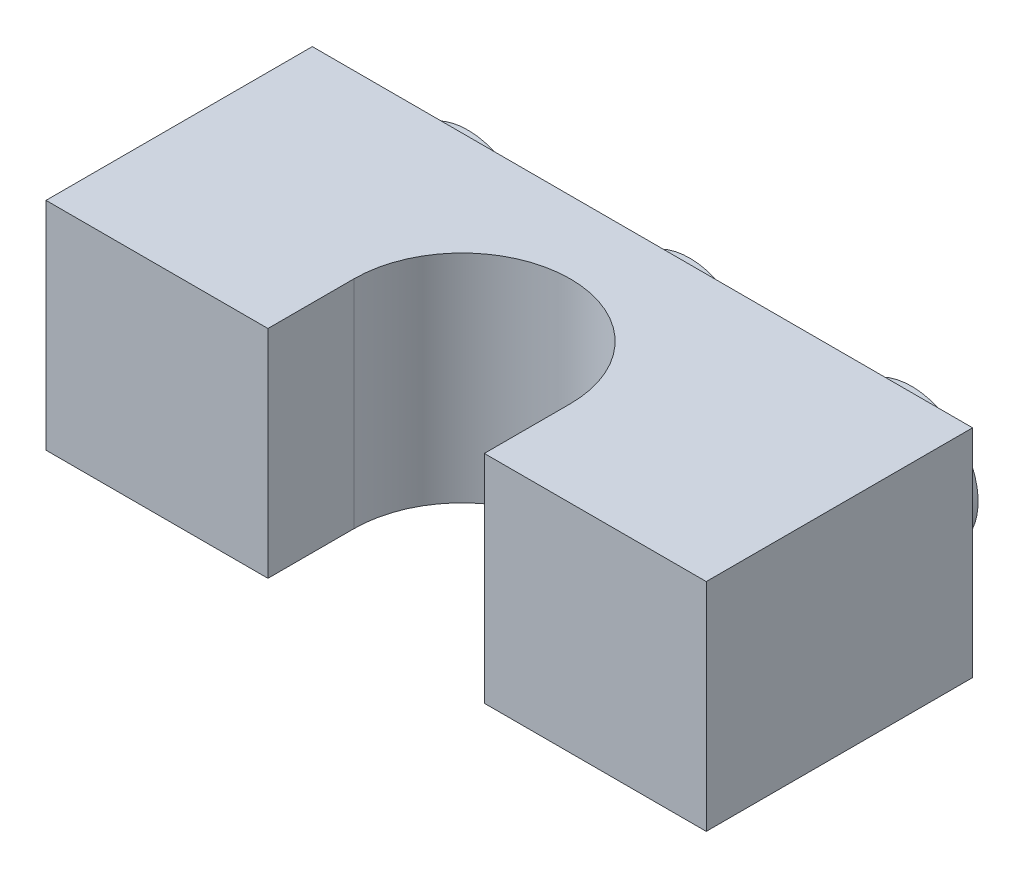
ISO-10303-21;
HEADER;
FILE_DESCRIPTION(('STEP AP214'),'2;1');
FILE_NAME('part.step','',(''),(''),'','','');
FILE_SCHEMA(('AUTOMOTIVE_DESIGN { 1 0 10303 214 1 1 1 1 }'));
ENDSEC;
DATA;
#1=APPLICATION_CONTEXT('core data for automotive mechanical design processes');
#2=APPLICATION_PROTOCOL_DEFINITION('international standard','automotive_design',2000,#1);
#3=PRODUCT_CONTEXT('',#1,'mechanical');
#4=PRODUCT('Part','Part','',(#3));
#5=PRODUCT_RELATED_PRODUCT_CATEGORY('part','',(#4));
#6=PRODUCT_DEFINITION_FORMATION('','',#4);
#7=PRODUCT_DEFINITION_CONTEXT('part definition',#1,'design');
#8=PRODUCT_DEFINITION('design','',#6,#7);
#9=PRODUCT_DEFINITION_SHAPE('','',#8);
#10=(LENGTH_UNIT() NAMED_UNIT(*) SI_UNIT(.MILLI.,.METRE.));
#11=(NAMED_UNIT(*) PLANE_ANGLE_UNIT() SI_UNIT($,.RADIAN.));
#12=(NAMED_UNIT(*) SI_UNIT($,.STERADIAN.) SOLID_ANGLE_UNIT());
#13=UNCERTAINTY_MEASURE_WITH_UNIT(LENGTH_MEASURE(1.E-05),#10,'distance_accuracy_value','');
#14=(GEOMETRIC_REPRESENTATION_CONTEXT(3) GLOBAL_UNCERTAINTY_ASSIGNED_CONTEXT((#13)) GLOBAL_UNIT_ASSIGNED_CONTEXT((#10,
#11,#12)) REPRESENTATION_CONTEXT('',''));
#15=CARTESIAN_POINT('',(0.,0.,0.));
#16=DIRECTION('',(0.,0.,1.));
#17=DIRECTION('',(1.,0.,0.));
#18=AXIS2_PLACEMENT_3D('',#15,#16,#17);
#19=CARTESIAN_POINT('',(0.,0.,9.6));
#20=DIRECTION('',(0.,0.,-1.));
#21=DIRECTION('',(-1.,0.,0.));
#22=AXIS2_PLACEMENT_3D('',#19,#20,#21);
#23=PLANE('',#22);
#24=DIRECTION('',(1.,0.,0.));
#25=VECTOR('',#24,1.);
#26=CARTESIAN_POINT('',(-11.9,-3.9,9.6));
#27=LINE('',#26,#25);
#28=CARTESIAN_POINT('',(-11.9,-3.9,9.6));
#29=VERTEX_POINT('',#28);
#30=CARTESIAN_POINT('',(-3.9,-3.9,9.6));
#31=VERTEX_POINT('',#30);
#32=EDGE_CURVE('E160',#29,#31,#27,.T.);
#33=ORIENTED_EDGE('',*,*,#32,.T.);
#34=DIRECTION('',(0.,1.,0.));
#35=VECTOR('',#34,1.);
#36=CARTESIAN_POINT('',(-3.9,0.,9.6));
#37=LINE('',#36,#35);
#38=CARTESIAN_POINT('',(-3.9,3.9,9.6));
#39=VERTEX_POINT('',#38);
#40=EDGE_CURVE('E11',#31,#39,#37,.T.);
#41=ORIENTED_EDGE('',*,*,#40,.T.);
#42=DIRECTION('',(-1.,0.,0.));
#43=VECTOR('',#42,1.);
#44=CARTESIAN_POINT('',(-11.9,3.9,9.6));
#45=LINE('',#44,#43);
#46=CARTESIAN_POINT('',(-11.9,3.9,9.6));
#47=VERTEX_POINT('',#46);
#48=EDGE_CURVE('E156',#39,#47,#45,.T.);
#49=ORIENTED_EDGE('',*,*,#48,.T.);
#50=DIRECTION('',(0.,-1.,0.));
#51=VECTOR('',#50,1.);
#52=CARTESIAN_POINT('',(-11.9,-3.9,9.6));
#53=LINE('',#52,#51);
#54=EDGE_CURVE('E158',#47,#29,#53,.T.);
#55=ORIENTED_EDGE('',*,*,#54,.T.);
#56=EDGE_LOOP('',(#33,#41,#49,#55));
#57=FACE_BOUND('',#56,.T.);
#58=ADVANCED_FACE('F35',(#57),#23,.F.);
#59=CARTESIAN_POINT('',(0.,0.,0.));
#60=DIRECTION('',(0.,0.,-1.));
#61=DIRECTION('',(-1.,0.,0.));
#62=AXIS2_PLACEMENT_3D('',#59,#60,#61);
#63=PLANE('',#62);
#64=CARTESIAN_POINT('',(-8.,0.,0.));
#65=DIRECTION('',(0.,0.,-1.));
#66=DIRECTION('',(-1.,0.,0.));
#67=AXIS2_PLACEMENT_3D('',#64,#65,#66);
#68=CIRCLE('',#67,2.4);
#69=CARTESIAN_POINT('',(-10.4,0.,0.));
#70=VERTEX_POINT('',#69);
#71=EDGE_CURVE('E139',#70,#70,#68,.T.);
#72=ORIENTED_EDGE('',*,*,#71,.F.);
#73=EDGE_LOOP('',(#72));
#74=FACE_BOUND('',#73,.T.);
#75=DIRECTION('',(0.,1.,0.));
#76=VECTOR('',#75,1.);
#77=CARTESIAN_POINT('',(11.9,-3.9,0.));
#78=LINE('',#77,#76);
#79=CARTESIAN_POINT('',(11.9,-3.9,0.));
#80=VERTEX_POINT('',#79);
#81=CARTESIAN_POINT('',(11.9,3.9,0.));
#82=VERTEX_POINT('',#81);
#83=EDGE_CURVE('E151',#80,#82,#78,.T.);
#84=ORIENTED_EDGE('',*,*,#83,.F.);
#85=DIRECTION('',(1.,0.,0.));
#86=VECTOR('',#85,1.);
#87=CARTESIAN_POINT('',(-11.9,-3.9,0.));
#88=LINE('',#87,#86);
#89=CARTESIAN_POINT('',(-11.9,-3.9,0.));
#90=VERTEX_POINT('',#89);
#91=EDGE_CURVE('E80',#90,#80,#88,.T.);
#92=ORIENTED_EDGE('',*,*,#91,.F.);
#93=DIRECTION('',(0.,-1.,0.));
#94=VECTOR('',#93,1.);
#95=CARTESIAN_POINT('',(-11.9,-3.9,0.));
#96=LINE('',#95,#94);
#97=CARTESIAN_POINT('',(-11.9,3.9,0.));
#98=VERTEX_POINT('',#97);
#99=EDGE_CURVE('E168',#98,#90,#96,.T.);
#100=ORIENTED_EDGE('',*,*,#99,.F.);
#101=DIRECTION('',(-1.,0.,0.));
#102=VECTOR('',#101,1.);
#103=CARTESIAN_POINT('',(-11.9,3.9,0.));
#104=LINE('',#103,#102);
#105=EDGE_CURVE('E166',#82,#98,#104,.T.);
#106=ORIENTED_EDGE('',*,*,#105,.F.);
#107=EDGE_LOOP('',(#84,#92,#100,#106));
#108=FACE_BOUND('',#107,.T.);
#109=CARTESIAN_POINT('',(0.,0.,0.));
#110=DIRECTION('',(0.,0.,-1.));
#111=DIRECTION('',(-1.,0.,0.));
#112=AXIS2_PLACEMENT_3D('',#109,#110,#111);
#113=CIRCLE('',#112,2.4);
#114=CARTESIAN_POINT('',(-2.4,0.,0.));
#115=VERTEX_POINT('',#114);
#116=EDGE_CURVE('E145',#115,#115,#113,.T.);
#117=ORIENTED_EDGE('',*,*,#116,.F.);
#118=EDGE_LOOP('',(#117));
#119=FACE_BOUND('',#118,.T.);
#120=CARTESIAN_POINT('',(8.,0.,0.));
#121=DIRECTION('',(0.,0.,-1.));
#122=DIRECTION('',(-1.,0.,0.));
#123=AXIS2_PLACEMENT_3D('',#120,#121,#122);
#124=CIRCLE('',#123,2.4);
#125=CARTESIAN_POINT('',(5.6,0.,0.));
#126=VERTEX_POINT('',#125);
#127=EDGE_CURVE('E134',#126,#126,#124,.T.);
#128=ORIENTED_EDGE('',*,*,#127,.F.);
#129=EDGE_LOOP('',(#128));
#130=FACE_BOUND('',#129,.T.);
#131=ADVANCED_FACE('F193',(#74,#108,#119,#130),#63,.T.);
#132=CARTESIAN_POINT('',(11.9,-3.9,9.6));
#133=DIRECTION('',(-1.,0.,0.));
#134=DIRECTION('',(0.,0.,1.));
#135=AXIS2_PLACEMENT_3D('',#132,#133,#134);
#136=PLANE('',#135);
#137=ORIENTED_EDGE('',*,*,#83,.T.);
#138=DIRECTION('',(0.,0.,-1.));
#139=VECTOR('',#138,1.);
#140=CARTESIAN_POINT('',(11.9,3.9,9.6));
#141=LINE('',#140,#139);
#142=CARTESIAN_POINT('',(11.9,3.9,9.6));
#143=VERTEX_POINT('',#142);
#144=EDGE_CURVE('E177',#143,#82,#141,.T.);
#145=ORIENTED_EDGE('',*,*,#144,.F.);
#146=DIRECTION('',(0.,1.,0.));
#147=VECTOR('',#146,1.);
#148=CARTESIAN_POINT('',(11.9,-3.9,9.6));
#149=LINE('',#148,#147);
#150=CARTESIAN_POINT('',(11.9,-3.9,9.6));
#151=VERTEX_POINT('',#150);
#152=EDGE_CURVE('E154',#151,#143,#149,.T.);
#153=ORIENTED_EDGE('',*,*,#152,.F.);
#154=DIRECTION('',(0.,0.,-1.));
#155=VECTOR('',#154,1.);
#156=CARTESIAN_POINT('',(11.9,-3.9,9.6));
#157=LINE('',#156,#155);
#158=EDGE_CURVE('E163',#151,#80,#157,.T.);
#159=ORIENTED_EDGE('',*,*,#158,.T.);
#160=EDGE_LOOP('',(#137,#145,#153,#159));
#161=FACE_BOUND('',#160,.T.);
#162=ADVANCED_FACE('F37',(#161),#136,.F.);
#163=CARTESIAN_POINT('',(-11.9,3.9,9.6));
#164=DIRECTION('',(0.,-1.,0.));
#165=DIRECTION('',(0.,0.,-1.));
#166=AXIS2_PLACEMENT_3D('',#163,#164,#165);
#167=PLANE('',#166);
#168=ORIENTED_EDGE('',*,*,#48,.F.);
#169=DIRECTION('',(0.,0.,1.));
#170=VECTOR('',#169,1.);
#171=CARTESIAN_POINT('',(-3.9,3.9,16.6));
#172=LINE('',#171,#170);
#173=CARTESIAN_POINT('',(-3.9,3.9,6.5));
#174=VERTEX_POINT('',#173);
#175=EDGE_CURVE('E130',#174,#39,#172,.T.);
#176=ORIENTED_EDGE('',*,*,#175,.F.);
#177=CARTESIAN_POINT('',(0.,3.9,6.5));
#178=DIRECTION('',(0.,1.,0.));
#179=DIRECTION('',(0.,0.,1.));
#180=AXIS2_PLACEMENT_3D('',#177,#178,#179);
#181=CIRCLE('',#180,3.9);
#182=CARTESIAN_POINT('',(3.9,3.9,6.5));
#183=VERTEX_POINT('',#182);
#184=EDGE_CURVE('E127',#183,#174,#181,.T.);
#185=ORIENTED_EDGE('',*,*,#184,.F.);
#186=DIRECTION('',(0.,0.,-1.));
#187=VECTOR('',#186,1.);
#188=CARTESIAN_POINT('',(3.9,3.9,16.6));
#189=LINE('',#188,#187);
#190=CARTESIAN_POINT('',(3.9,3.9,9.6));
#191=VERTEX_POINT('',#190);
#192=EDGE_CURVE('E112',#191,#183,#189,.T.);
#193=ORIENTED_EDGE('',*,*,#192,.F.);
#194=EDGE_CURVE('E88',#143,#191,#45,.T.);
#195=ORIENTED_EDGE('',*,*,#194,.F.);
#196=ORIENTED_EDGE('',*,*,#144,.T.);
#197=ORIENTED_EDGE('',*,*,#105,.T.);
#198=DIRECTION('',(0.,0.,-1.));
#199=VECTOR('',#198,1.);
#200=CARTESIAN_POINT('',(-11.9,3.9,9.6));
#201=LINE('',#200,#199);
#202=EDGE_CURVE('E174',#47,#98,#201,.T.);
#203=ORIENTED_EDGE('',*,*,#202,.F.);
#204=EDGE_LOOP('',(#168,#176,#185,#193,#195,#196,#197,#203));
#205=FACE_BOUND('',#204,.T.);
#206=ADVANCED_FACE('F180',(#205),#167,.F.);
#207=CARTESIAN_POINT('',(-11.9,-3.9,9.6));
#208=DIRECTION('',(1.,0.,0.));
#209=DIRECTION('',(0.,0.,-1.));
#210=AXIS2_PLACEMENT_3D('',#207,#208,#209);
#211=PLANE('',#210);
#212=ORIENTED_EDGE('',*,*,#99,.T.);
#213=DIRECTION('',(0.,0.,-1.));
#214=VECTOR('',#213,1.);
#215=CARTESIAN_POINT('',(-11.9,-3.9,9.6));
#216=LINE('',#215,#214);
#217=EDGE_CURVE('E172',#29,#90,#216,.T.);
#218=ORIENTED_EDGE('',*,*,#217,.F.);
#219=ORIENTED_EDGE('',*,*,#54,.F.);
#220=ORIENTED_EDGE('',*,*,#202,.T.);
#221=EDGE_LOOP('',(#212,#218,#219,#220));
#222=FACE_BOUND('',#221,.T.);
#223=ADVANCED_FACE('F198',(#222),#211,.F.);
#224=CARTESIAN_POINT('',(-11.9,-3.9,9.6));
#225=DIRECTION('',(0.,1.,0.));
#226=DIRECTION('',(0.,0.,1.));
#227=AXIS2_PLACEMENT_3D('',#224,#225,#226);
#228=PLANE('',#227);
#229=CARTESIAN_POINT('',(0.,-3.9,6.5));
#230=DIRECTION('',(0.,1.,0.));
#231=DIRECTION('',(0.,0.,1.));
#232=AXIS2_PLACEMENT_3D('',#229,#230,#231);
#233=CIRCLE('',#232,3.9);
#234=CARTESIAN_POINT('',(3.9,-3.9,6.5));
#235=VERTEX_POINT('',#234);
#236=CARTESIAN_POINT('',(-3.9,-3.9,6.5));
#237=VERTEX_POINT('',#236);
#238=EDGE_CURVE('E117',#235,#237,#233,.T.);
#239=ORIENTED_EDGE('',*,*,#238,.T.);
#240=DIRECTION('',(0.,0.,1.));
#241=VECTOR('',#240,1.);
#242=CARTESIAN_POINT('',(-3.9,-3.9,16.6));
#243=LINE('',#242,#241);
#244=EDGE_CURVE('E125',#237,#31,#243,.T.);
#245=ORIENTED_EDGE('',*,*,#244,.T.);
#246=ORIENTED_EDGE('',*,*,#32,.F.);
#247=ORIENTED_EDGE('',*,*,#217,.T.);
#248=ORIENTED_EDGE('',*,*,#91,.T.);
#249=ORIENTED_EDGE('',*,*,#158,.F.);
#250=CARTESIAN_POINT('',(3.9,-3.9,9.6));
#251=VERTEX_POINT('',#250);
#252=EDGE_CURVE('E58',#251,#151,#27,.T.);
#253=ORIENTED_EDGE('',*,*,#252,.F.);
#254=DIRECTION('',(0.,0.,-1.));
#255=VECTOR('',#254,1.);
#256=CARTESIAN_POINT('',(3.9,-3.9,16.6));
#257=LINE('',#256,#255);
#258=EDGE_CURVE('E50',#251,#235,#257,.T.);
#259=ORIENTED_EDGE('',*,*,#258,.T.);
#260=EDGE_LOOP('',(#239,#245,#246,#247,#248,#249,#253,#259));
#261=FACE_BOUND('',#260,.T.);
#262=ADVANCED_FACE('F124',(#261),#228,.F.);
#263=ORIENTED_EDGE('',*,*,#194,.T.);
#264=DIRECTION('',(0.,-1.,0.));
#265=VECTOR('',#264,1.);
#266=CARTESIAN_POINT('',(3.9,0.,9.6));
#267=LINE('',#266,#265);
#268=EDGE_CURVE('E43',#191,#251,#267,.T.);
#269=ORIENTED_EDGE('',*,*,#268,.T.);
#270=ORIENTED_EDGE('',*,*,#252,.T.);
#271=ORIENTED_EDGE('',*,*,#152,.T.);
#272=EDGE_LOOP('',(#263,#269,#270,#271));
#273=FACE_BOUND('',#272,.T.);
#274=ADVANCED_FACE('F178',(#273),#23,.F.);
#275=CARTESIAN_POINT('',(0.,0.,-1.7));
#276=DIRECTION('',(0.,0.,1.));
#277=DIRECTION('',(1.,0.,0.));
#278=AXIS2_PLACEMENT_3D('',#275,#276,#277);
#279=CYLINDRICAL_SURFACE('',#278,2.4);
#280=CARTESIAN_POINT('',(0.,0.,-1.7));
#281=DIRECTION('',(0.,0.,-1.));
#282=DIRECTION('',(-1.,0.,0.));
#283=AXIS2_PLACEMENT_3D('',#280,#281,#282);
#284=CIRCLE('',#283,2.4);
#285=CARTESIAN_POINT('',(-2.4,0.,-1.7));
#286=VERTEX_POINT('',#285);
#287=EDGE_CURVE('E148',#286,#286,#284,.T.);
#288=ORIENTED_EDGE('',*,*,#287,.F.);
#289=EDGE_LOOP('',(#288));
#290=FACE_BOUND('',#289,.T.);
#291=ORIENTED_EDGE('',*,*,#116,.T.);
#292=EDGE_LOOP('',(#291));
#293=FACE_BOUND('',#292,.T.);
#294=ADVANCED_FACE('F215',(#290,#293),#279,.T.);
#295=CARTESIAN_POINT('',(0.,0.,-1.7));
#296=DIRECTION('',(0.,0.,-1.));
#297=DIRECTION('',(-1.,0.,0.));
#298=AXIS2_PLACEMENT_3D('',#295,#296,#297);
#299=PLANE('',#298);
#300=ORIENTED_EDGE('',*,*,#287,.T.);
#301=EDGE_LOOP('',(#300));
#302=FACE_BOUND('',#301,.T.);
#303=ADVANCED_FACE('F219',(#302),#299,.T.);
#304=CARTESIAN_POINT('',(-8.,0.,-1.7));
#305=DIRECTION('',(0.,0.,1.));
#306=DIRECTION('',(1.,0.,0.));
#307=AXIS2_PLACEMENT_3D('',#304,#305,#306);
#308=CYLINDRICAL_SURFACE('',#307,2.4);
#309=CARTESIAN_POINT('',(-8.,0.,-1.7));
#310=DIRECTION('',(0.,0.,-1.));
#311=DIRECTION('',(-1.,0.,0.));
#312=AXIS2_PLACEMENT_3D('',#309,#310,#311);
#313=CIRCLE('',#312,2.4);
#314=CARTESIAN_POINT('',(-10.4,0.,-1.7));
#315=VERTEX_POINT('',#314);
#316=EDGE_CURVE('E142',#315,#315,#313,.T.);
#317=ORIENTED_EDGE('',*,*,#316,.F.);
#318=EDGE_LOOP('',(#317));
#319=FACE_BOUND('',#318,.T.);
#320=ORIENTED_EDGE('',*,*,#71,.T.);
#321=EDGE_LOOP('',(#320));
#322=FACE_BOUND('',#321,.T.);
#323=ADVANCED_FACE('F224',(#319,#322),#308,.T.);
#324=CARTESIAN_POINT('',(-8.,0.,-1.7));
#325=DIRECTION('',(0.,0.,-1.));
#326=DIRECTION('',(-1.,0.,0.));
#327=AXIS2_PLACEMENT_3D('',#324,#325,#326);
#328=PLANE('',#327);
#329=ORIENTED_EDGE('',*,*,#316,.T.);
#330=EDGE_LOOP('',(#329));
#331=FACE_BOUND('',#330,.T.);
#332=ADVANCED_FACE('F232',(#331),#328,.T.);
#333=CARTESIAN_POINT('',(8.,0.,-1.7));
#334=DIRECTION('',(0.,0.,1.));
#335=DIRECTION('',(1.,0.,0.));
#336=AXIS2_PLACEMENT_3D('',#333,#334,#335);
#337=CYLINDRICAL_SURFACE('',#336,2.4);
#338=CARTESIAN_POINT('',(8.,0.,-1.7));
#339=DIRECTION('',(0.,0.,-1.));
#340=DIRECTION('',(-1.,0.,0.));
#341=AXIS2_PLACEMENT_3D('',#338,#339,#340);
#342=CIRCLE('',#341,2.4);
#343=CARTESIAN_POINT('',(5.6,0.,-1.7));
#344=VERTEX_POINT('',#343);
#345=EDGE_CURVE('E136',#344,#344,#342,.T.);
#346=ORIENTED_EDGE('',*,*,#345,.F.);
#347=EDGE_LOOP('',(#346));
#348=FACE_BOUND('',#347,.T.);
#349=ORIENTED_EDGE('',*,*,#127,.T.);
#350=EDGE_LOOP('',(#349));
#351=FACE_BOUND('',#350,.T.);
#352=ADVANCED_FACE('F236',(#348,#351),#337,.T.);
#353=CARTESIAN_POINT('',(8.,0.,-1.7));
#354=DIRECTION('',(0.,0.,-1.));
#355=DIRECTION('',(-1.,0.,0.));
#356=AXIS2_PLACEMENT_3D('',#353,#354,#355);
#357=PLANE('',#356);
#358=ORIENTED_EDGE('',*,*,#345,.T.);
#359=EDGE_LOOP('',(#358));
#360=FACE_BOUND('',#359,.T.);
#361=ADVANCED_FACE('F240',(#360),#357,.T.);
#362=CARTESIAN_POINT('',(-3.9,-3.9,16.6));
#363=DIRECTION('',(-1.,0.,0.));
#364=DIRECTION('',(0.,0.,1.));
#365=AXIS2_PLACEMENT_3D('',#362,#363,#364);
#366=PLANE('',#365);
#367=ORIENTED_EDGE('',*,*,#244,.F.);
#368=DIRECTION('',(0.,1.,0.));
#369=VECTOR('',#368,1.);
#370=CARTESIAN_POINT('',(-3.9,-3.9,6.5));
#371=LINE('',#370,#369);
#372=EDGE_CURVE('E116',#237,#174,#371,.T.);
#373=ORIENTED_EDGE('',*,*,#372,.T.);
#374=ORIENTED_EDGE('',*,*,#175,.T.);
#375=ORIENTED_EDGE('',*,*,#40,.F.);
#376=EDGE_LOOP('',(#367,#373,#374,#375));
#377=FACE_BOUND('',#376,.T.);
#378=ADVANCED_FACE('F184',(#377),#366,.F.);
#379=CARTESIAN_POINT('',(3.9,-3.9,16.6));
#380=DIRECTION('',(1.,0.,0.));
#381=DIRECTION('',(0.,0.,-1.));
#382=AXIS2_PLACEMENT_3D('',#379,#380,#381);
#383=PLANE('',#382);
#384=ORIENTED_EDGE('',*,*,#192,.T.);
#385=DIRECTION('',(0.,1.,0.));
#386=VECTOR('',#385,1.);
#387=CARTESIAN_POINT('',(3.9,-3.9,6.5));
#388=LINE('',#387,#386);
#389=EDGE_CURVE('E109',#235,#183,#388,.T.);
#390=ORIENTED_EDGE('',*,*,#389,.F.);
#391=ORIENTED_EDGE('',*,*,#258,.F.);
#392=ORIENTED_EDGE('',*,*,#268,.F.);
#393=EDGE_LOOP('',(#384,#390,#391,#392));
#394=FACE_BOUND('',#393,.T.);
#395=ADVANCED_FACE('F111',(#394),#383,.F.);
#396=CARTESIAN_POINT('',(0.,-3.9,6.5));
#397=DIRECTION('',(0.,1.,0.));
#398=DIRECTION('',(0.,0.,1.));
#399=AXIS2_PLACEMENT_3D('',#396,#397,#398);
#400=CYLINDRICAL_SURFACE('',#399,3.9);
#401=ORIENTED_EDGE('',*,*,#184,.T.);
#402=ORIENTED_EDGE('',*,*,#372,.F.);
#403=ORIENTED_EDGE('',*,*,#238,.F.);
#404=ORIENTED_EDGE('',*,*,#389,.T.);
#405=EDGE_LOOP('',(#401,#402,#403,#404));
#406=FACE_BOUND('',#405,.T.);
#407=ADVANCED_FACE('F120',(#406),#400,.F.);
#408=CLOSED_SHELL('',(#58,#131,#162,#206,#223,#262,#274,#294,#303,#323,#332,#352,#361,#378,#395,#407));
#409=MANIFOLD_SOLID_BREP('B2',#408);
#410=ADVANCED_BREP_SHAPE_REPRESENTATION('',(#18,#409),#14);
#411=SHAPE_DEFINITION_REPRESENTATION(#9,#410);
ENDSEC;
END-ISO-10303-21;
